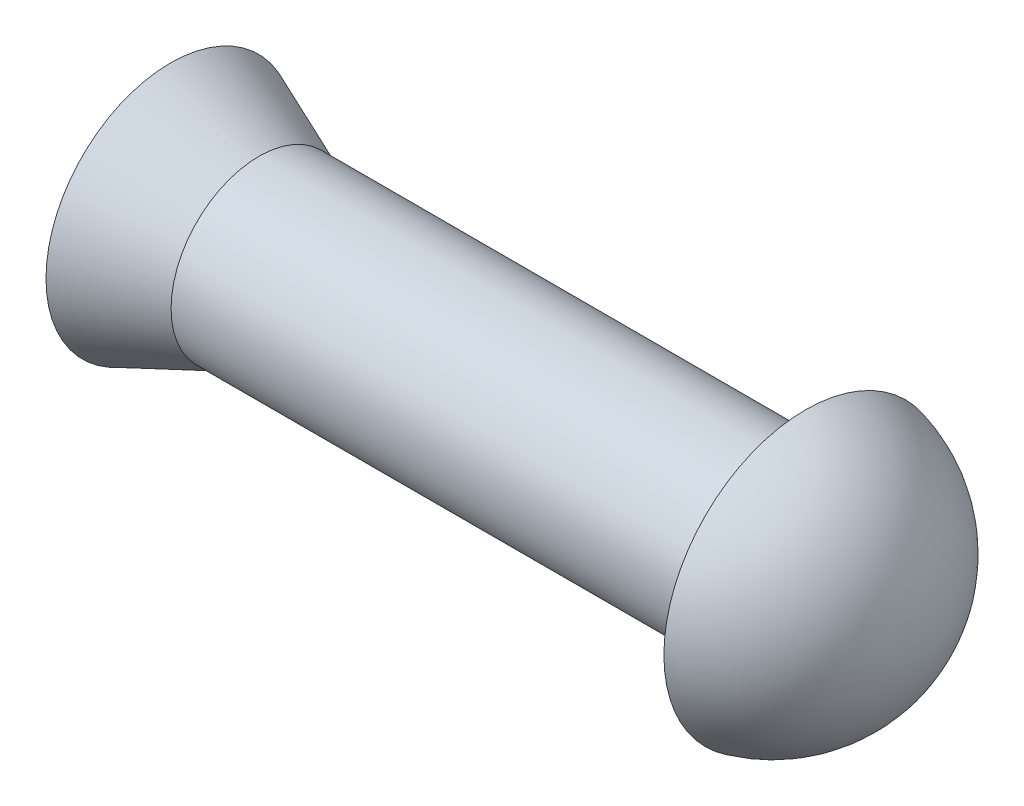
ISO-10303-21;
HEADER;
FILE_DESCRIPTION(('STEP AP214'),'2;1');
FILE_NAME('part.step','',(''),(''),'','','');
FILE_SCHEMA(('AUTOMOTIVE_DESIGN { 1 0 10303 214 1 1 1 1 }'));
ENDSEC;
DATA;
#1=APPLICATION_CONTEXT('core data for automotive mechanical design processes');
#2=APPLICATION_PROTOCOL_DEFINITION('international standard','automotive_design',2000,#1);
#3=PRODUCT_CONTEXT('',#1,'mechanical');
#4=PRODUCT('Part','Part','',(#3));
#5=PRODUCT_RELATED_PRODUCT_CATEGORY('part','',(#4));
#6=PRODUCT_DEFINITION_FORMATION('','',#4);
#7=PRODUCT_DEFINITION_CONTEXT('part definition',#1,'design');
#8=PRODUCT_DEFINITION('design','',#6,#7);
#9=PRODUCT_DEFINITION_SHAPE('','',#8);
#10=(LENGTH_UNIT() NAMED_UNIT(*) SI_UNIT(.MILLI.,.METRE.));
#11=(NAMED_UNIT(*) PLANE_ANGLE_UNIT() SI_UNIT($,.RADIAN.));
#12=(NAMED_UNIT(*) SI_UNIT($,.STERADIAN.) SOLID_ANGLE_UNIT());
#13=UNCERTAINTY_MEASURE_WITH_UNIT(LENGTH_MEASURE(1.E-05),#10,'distance_accuracy_value','');
#14=(GEOMETRIC_REPRESENTATION_CONTEXT(3) GLOBAL_UNCERTAINTY_ASSIGNED_CONTEXT((#13)) GLOBAL_UNIT_ASSIGNED_CONTEXT((#10,
#11,#12)) REPRESENTATION_CONTEXT('',''));
#15=CARTESIAN_POINT('',(0.,0.,0.));
#16=DIRECTION('',(0.,0.,1.));
#17=DIRECTION('',(1.,0.,0.));
#18=AXIS2_PLACEMENT_3D('',#15,#16,#17);
#19=CARTESIAN_POINT('',(-39.,0.,0.));
#20=DIRECTION('',(-1.,0.,0.));
#21=DIRECTION('',(0.,0.,1.));
#22=AXIS2_PLACEMENT_3D('',#19,#20,#21);
#23=CYLINDRICAL_SURFACE('',#22,18.);
#24=CARTESIAN_POINT('',(-111.893398282202,0.,0.));
#25=DIRECTION('',(-1.,0.,0.));
#26=DIRECTION('',(0.,0.,1.));
#27=AXIS2_PLACEMENT_3D('',#24,#25,#26);
#28=CIRCLE('',#27,18.);
#29=CARTESIAN_POINT('',(-111.893398282202,0.,18.));
#30=VERTEX_POINT('',#29);
#31=EDGE_CURVE('E10',#30,#30,#28,.T.);
#32=ORIENTED_EDGE('',*,*,#31,.F.);
#33=EDGE_LOOP('',(#32));
#34=FACE_BOUND('',#33,.T.);
#35=CARTESIAN_POINT('',(0.,0.,0.));
#36=DIRECTION('',(1.,0.,0.));
#37=DIRECTION('',(0.,0.,-1.));
#38=AXIS2_PLACEMENT_3D('',#35,#36,#37);
#39=CIRCLE('',#38,18.);
#40=CARTESIAN_POINT('',(0.,0.,-18.));
#41=VERTEX_POINT('',#40);
#42=EDGE_CURVE('E40',#41,#41,#39,.T.);
#43=ORIENTED_EDGE('',*,*,#42,.F.);
#44=EDGE_LOOP('',(#43));
#45=FACE_BOUND('',#44,.T.);
#46=ADVANCED_FACE('F30',(#34,#45),#23,.T.);
#47=CARTESIAN_POINT('',(-111.893398282202,0.,0.));
#48=DIRECTION('',(-1.,0.,0.));
#49=DIRECTION('',(0.,0.,1.));
#50=AXIS2_PLACEMENT_3D('',#47,#48,#49);
#51=CONICAL_SURFACE('',#50,18.,0.392699081698725);
#52=CARTESIAN_POINT('',(-130.,0.,0.));
#53=DIRECTION('',(-1.,0.,0.));
#54=DIRECTION('',(0.,0.,1.));
#55=AXIS2_PLACEMENT_3D('',#52,#53,#54);
#56=CIRCLE('',#55,25.5);
#57=CARTESIAN_POINT('',(-130.,0.,25.5));
#58=VERTEX_POINT('',#57);
#59=EDGE_CURVE('E36',#58,#58,#56,.T.);
#60=ORIENTED_EDGE('',*,*,#59,.F.);
#61=EDGE_LOOP('',(#60));
#62=FACE_BOUND('',#61,.T.);
#63=ORIENTED_EDGE('',*,*,#31,.T.);
#64=EDGE_LOOP('',(#63));
#65=FACE_BOUND('',#64,.T.);
#66=ADVANCED_FACE('F62',(#62,#65),#51,.T.);
#67=CARTESIAN_POINT('',(38.0766194329241,0.,0.));
#68=DIRECTION('',(-1.,0.,0.));
#69=DIRECTION('',(0.,1.,0.));
#70=AXIS2_PLACEMENT_3D('',#67,#68,#69);
#71=SPHERICAL_SURFACE('',#70,170.);
#72=ORIENTED_EDGE('',*,*,#59,.T.);
#73=EDGE_LOOP('',(#72));
#74=FACE_BOUND('',#73,.T.);
#75=ADVANCED_FACE('F58',(#74),#71,.T.);
#76=CARTESIAN_POINT('',(0.,0.,0.));
#77=DIRECTION('',(1.,0.,0.));
#78=DIRECTION('',(0.,0.,-1.));
#79=AXIS2_PLACEMENT_3D('',#76,#77,#78);
#80=PLANE('',#79);
#81=ORIENTED_EDGE('',*,*,#42,.T.);
#82=EDGE_LOOP('',(#81));
#83=FACE_BOUND('',#82,.T.);
#84=CARTESIAN_POINT('',(0.,0.,0.));
#85=DIRECTION('',(-1.,0.,0.));
#86=DIRECTION('',(0.,0.,1.));
#87=AXIS2_PLACEMENT_3D('',#84,#85,#86);
#88=CIRCLE('',#87,29.);
#89=CARTESIAN_POINT('',(0.,0.,29.));
#90=VERTEX_POINT('',#89);
#91=EDGE_CURVE('E44',#90,#90,#88,.T.);
#92=ORIENTED_EDGE('',*,*,#91,.T.);
#93=EDGE_LOOP('',(#92));
#94=FACE_BOUND('',#93,.T.);
#95=ADVANCED_FACE('F50',(#83,#94),#80,.F.);
#96=CARTESIAN_POINT('',(-6.78260869565218,0.,0.));
#97=DIRECTION('',(-1.,0.,0.));
#98=DIRECTION('',(0.,1.,0.));
#99=AXIS2_PLACEMENT_3D('',#96,#97,#98);
#100=SPHERICAL_SURFACE('',#99,29.7826086956522);
#101=ORIENTED_EDGE('',*,*,#91,.F.);
#102=EDGE_LOOP('',(#101));
#103=FACE_BOUND('',#102,.T.);
#104=ADVANCED_FACE('F52',(#103),#100,.T.);
#105=CLOSED_SHELL('',(#46,#66,#75,#95,#104));
#106=MANIFOLD_SOLID_BREP('B2',#105);
#107=ADVANCED_BREP_SHAPE_REPRESENTATION('',(#18,#106),#14);
#108=SHAPE_DEFINITION_REPRESENTATION(#9,#107);
ENDSEC;
END-ISO-10303-21;
